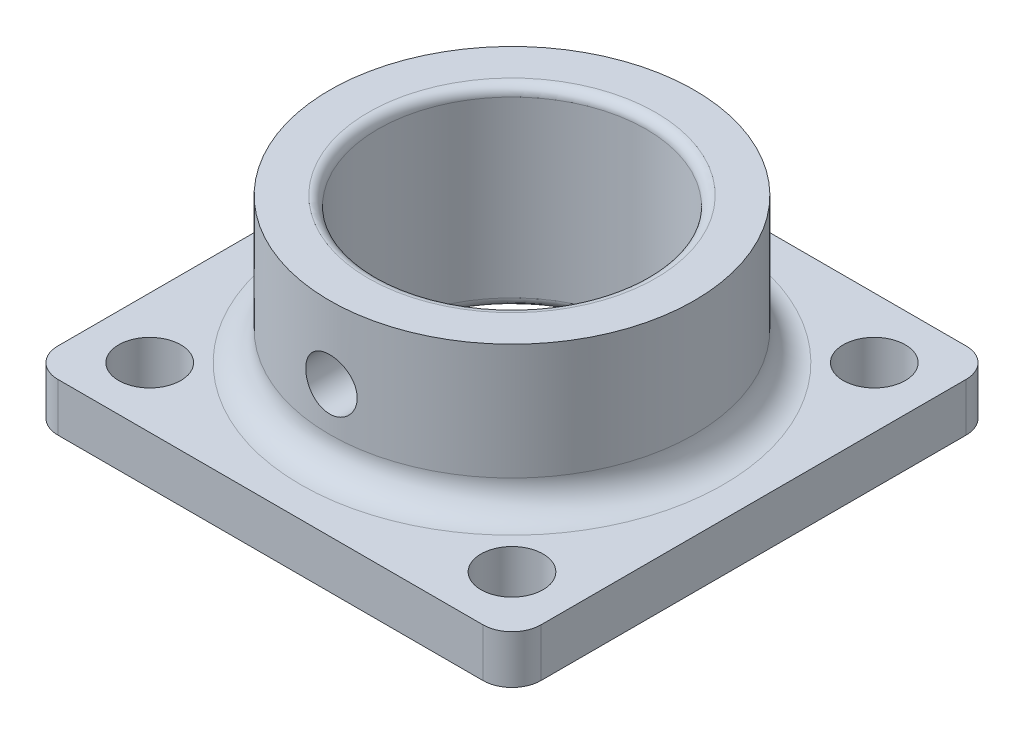
ISO-10303-21;
HEADER;
FILE_DESCRIPTION(('STEP AP214'),'2;1');
FILE_NAME('part.step','',(''),(''),'','','');
FILE_SCHEMA(('AUTOMOTIVE_DESIGN { 1 0 10303 214 1 1 1 1 }'));
ENDSEC;
DATA;
#1=APPLICATION_CONTEXT('core data for automotive mechanical design processes');
#2=APPLICATION_PROTOCOL_DEFINITION('international standard','automotive_design',2000,#1);
#3=PRODUCT_CONTEXT('',#1,'mechanical');
#4=PRODUCT('Part','Part','',(#3));
#5=PRODUCT_RELATED_PRODUCT_CATEGORY('part','',(#4));
#6=PRODUCT_DEFINITION_FORMATION('','',#4);
#7=PRODUCT_DEFINITION_CONTEXT('part definition',#1,'design');
#8=PRODUCT_DEFINITION('design','',#6,#7);
#9=PRODUCT_DEFINITION_SHAPE('','',#8);
#10=(LENGTH_UNIT() NAMED_UNIT(*) SI_UNIT(.MILLI.,.METRE.));
#11=(NAMED_UNIT(*) PLANE_ANGLE_UNIT() SI_UNIT($,.RADIAN.));
#12=(NAMED_UNIT(*) SI_UNIT($,.STERADIAN.) SOLID_ANGLE_UNIT());
#13=UNCERTAINTY_MEASURE_WITH_UNIT(LENGTH_MEASURE(1.E-05),#10,'distance_accuracy_value','');
#14=(GEOMETRIC_REPRESENTATION_CONTEXT(3) GLOBAL_UNCERTAINTY_ASSIGNED_CONTEXT((#13)) GLOBAL_UNIT_ASSIGNED_CONTEXT((#10,
#11,#12)) REPRESENTATION_CONTEXT('',''));
#15=CARTESIAN_POINT('',(0.,0.,0.));
#16=DIRECTION('',(0.,0.,1.));
#17=DIRECTION('',(1.,0.,0.));
#18=AXIS2_PLACEMENT_3D('',#15,#16,#17);
#19=CARTESIAN_POINT('',(0.,2.54,0.));
#20=DIRECTION('',(0.,1.,0.));
#21=DIRECTION('',(0.,0.,1.));
#22=AXIS2_PLACEMENT_3D('',#19,#20,#21);
#23=PLANE('',#22);
#24=CARTESIAN_POINT('',(9.525,2.54,-9.525));
#25=DIRECTION('',(0.,1.,0.));
#26=DIRECTION('',(0.,0.,1.));
#27=AXIS2_PLACEMENT_3D('',#24,#25,#26);
#28=CIRCLE('',#27,1.63194999999999);
#29=CARTESIAN_POINT('',(9.525,2.54,-7.89305000000001));
#30=VERTEX_POINT('',#29);
#31=EDGE_CURVE('E362',#30,#30,#28,.T.);
#32=ORIENTED_EDGE('',*,*,#31,.F.);
#33=EDGE_LOOP('',(#32));
#34=FACE_BOUND('',#33,.T.);
#35=CARTESIAN_POINT('',(9.525,2.54,9.525));
#36=DIRECTION('',(0.,1.,0.));
#37=DIRECTION('',(0.,0.,1.));
#38=AXIS2_PLACEMENT_3D('',#35,#36,#37);
#39=CIRCLE('',#38,1.63194999999999);
#40=CARTESIAN_POINT('',(9.525,2.54,11.15695));
#41=VERTEX_POINT('',#40);
#42=EDGE_CURVE('E364',#41,#41,#39,.T.);
#43=ORIENTED_EDGE('',*,*,#42,.F.);
#44=EDGE_LOOP('',(#43));
#45=FACE_BOUND('',#44,.T.);
#46=CARTESIAN_POINT('',(-9.525,2.54,9.525));
#47=DIRECTION('',(0.,1.,0.));
#48=DIRECTION('',(0.,0.,1.));
#49=AXIS2_PLACEMENT_3D('',#46,#47,#48);
#50=CIRCLE('',#49,1.63194999999999);
#51=CARTESIAN_POINT('',(-9.525,2.54,11.15695));
#52=VERTEX_POINT('',#51);
#53=EDGE_CURVE('E372',#52,#52,#50,.T.);
#54=ORIENTED_EDGE('',*,*,#53,.F.);
#55=EDGE_LOOP('',(#54));
#56=FACE_BOUND('',#55,.T.);
#57=CARTESIAN_POINT('',(-9.525,2.54,-9.525));
#58=DIRECTION('',(0.,1.,0.));
#59=DIRECTION('',(0.,0.,1.));
#60=AXIS2_PLACEMENT_3D('',#57,#58,#59);
#61=CIRCLE('',#60,1.63194999999999);
#62=CARTESIAN_POINT('',(-9.525,2.54,-7.89305000000001));
#63=VERTEX_POINT('',#62);
#64=EDGE_CURVE('E377',#63,#63,#61,.T.);
#65=ORIENTED_EDGE('',*,*,#64,.F.);
#66=EDGE_LOOP('',(#65));
#67=FACE_BOUND('',#66,.T.);
#68=CARTESIAN_POINT('',(0.,2.54,0.));
#69=DIRECTION('',(0.,1.,0.));
#70=DIRECTION('',(0.,0.,1.));
#71=AXIS2_PLACEMENT_3D('',#68,#69,#70);
#72=CIRCLE('',#71,11.1125);
#73=CARTESIAN_POINT('',(0.,2.54,11.1125));
#74=VERTEX_POINT('',#73);
#75=EDGE_CURVE('E388',#74,#74,#72,.F.);
#76=ORIENTED_EDGE('',*,*,#75,.T.);
#77=EDGE_LOOP('',(#76));
#78=FACE_BOUND('',#77,.T.);
#79=DIRECTION('',(-1.,0.,0.));
#80=VECTOR('',#79,1.);
#81=CARTESIAN_POINT('',(-12.7,2.54,-12.7));
#82=LINE('',#81,#80);
#83=CARTESIAN_POINT('',(11.176,2.54,-12.7));
#84=VERTEX_POINT('',#83);
#85=CARTESIAN_POINT('',(-11.176,2.54,-12.7));
#86=VERTEX_POINT('',#85);
#87=EDGE_CURVE('E143',#84,#86,#82,.T.);
#88=ORIENTED_EDGE('',*,*,#87,.T.);
#89=CARTESIAN_POINT('',(-11.176,2.54,-11.176));
#90=DIRECTION('',(0.,1.,0.));
#91=DIRECTION('',(0.,0.,1.));
#92=AXIS2_PLACEMENT_3D('',#89,#90,#91);
#93=CIRCLE('',#92,1.524);
#94=CARTESIAN_POINT('',(-12.7,2.54,-11.176));
#95=VERTEX_POINT('',#94);
#96=EDGE_CURVE('E391',#86,#95,#93,.T.);
#97=ORIENTED_EDGE('',*,*,#96,.T.);
#98=DIRECTION('',(0.,0.,1.));
#99=VECTOR('',#98,1.);
#100=CARTESIAN_POINT('',(-12.7,2.54,-12.7));
#101=LINE('',#100,#99);
#102=CARTESIAN_POINT('',(-12.7,2.54,11.176));
#103=VERTEX_POINT('',#102);
#104=EDGE_CURVE('E126',#95,#103,#101,.T.);
#105=ORIENTED_EDGE('',*,*,#104,.T.);
#106=CARTESIAN_POINT('',(-11.176,2.54,11.176));
#107=DIRECTION('',(0.,1.,0.));
#108=DIRECTION('',(0.,0.,1.));
#109=AXIS2_PLACEMENT_3D('',#106,#107,#108);
#110=CIRCLE('',#109,1.524);
#111=CARTESIAN_POINT('',(-11.176,2.54,12.7));
#112=VERTEX_POINT('',#111);
#113=EDGE_CURVE('E401',#103,#112,#110,.T.);
#114=ORIENTED_EDGE('',*,*,#113,.T.);
#115=DIRECTION('',(1.,0.,0.));
#116=VECTOR('',#115,1.);
#117=CARTESIAN_POINT('',(-12.7,2.54,12.7));
#118=LINE('',#117,#116);
#119=CARTESIAN_POINT('',(11.176,2.54,12.7));
#120=VERTEX_POINT('',#119);
#121=EDGE_CURVE('E407',#112,#120,#118,.T.);
#122=ORIENTED_EDGE('',*,*,#121,.T.);
#123=CARTESIAN_POINT('',(11.176,2.54,11.176));
#124=DIRECTION('',(0.,1.,0.));
#125=DIRECTION('',(0.,0.,1.));
#126=AXIS2_PLACEMENT_3D('',#123,#124,#125);
#127=CIRCLE('',#126,1.524);
#128=CARTESIAN_POINT('',(12.7,2.54,11.176));
#129=VERTEX_POINT('',#128);
#130=EDGE_CURVE('E61',#120,#129,#127,.T.);
#131=ORIENTED_EDGE('',*,*,#130,.T.);
#132=DIRECTION('',(0.,0.,-1.));
#133=VECTOR('',#132,1.);
#134=CARTESIAN_POINT('',(12.7,2.54,-12.7));
#135=LINE('',#134,#133);
#136=CARTESIAN_POINT('',(12.7,2.54,-11.176));
#137=VERTEX_POINT('',#136);
#138=EDGE_CURVE('E396',#129,#137,#135,.T.);
#139=ORIENTED_EDGE('',*,*,#138,.T.);
#140=CARTESIAN_POINT('',(11.176,2.54,-11.176));
#141=DIRECTION('',(0.,1.,0.));
#142=DIRECTION('',(0.,0.,1.));
#143=AXIS2_PLACEMENT_3D('',#140,#141,#142);
#144=CIRCLE('',#143,1.524);
#145=EDGE_CURVE('E393',#137,#84,#144,.T.);
#146=ORIENTED_EDGE('',*,*,#145,.T.);
#147=EDGE_LOOP('',(#88,#97,#105,#114,#122,#131,#139,#146));
#148=FACE_BOUND('',#147,.T.);
#149=ADVANCED_FACE('F39',(#34,#45,#56,#67,#78,#148),#23,.T.);
#150=CARTESIAN_POINT('',(-12.7,2.54,-12.7));
#151=DIRECTION('',(1.,0.,0.));
#152=DIRECTION('',(0.,0.,-1.));
#153=AXIS2_PLACEMENT_3D('',#150,#151,#152);
#154=PLANE('',#153);
#155=ORIENTED_EDGE('',*,*,#104,.F.);
#156=DIRECTION('',(0.,-1.,0.));
#157=VECTOR('',#156,1.);
#158=CARTESIAN_POINT('',(-12.7,2.54,-11.176));
#159=LINE('',#158,#157);
#160=CARTESIAN_POINT('',(-12.7,0.,-11.176));
#161=VERTEX_POINT('',#160);
#162=EDGE_CURVE('E110',#95,#161,#159,.T.);
#163=ORIENTED_EDGE('',*,*,#162,.T.);
#164=DIRECTION('',(0.,0.,1.));
#165=VECTOR('',#164,1.);
#166=CARTESIAN_POINT('',(-12.7,0.,-12.7));
#167=LINE('',#166,#165);
#168=CARTESIAN_POINT('',(-12.7,0.,11.176));
#169=VERTEX_POINT('',#168);
#170=EDGE_CURVE('E123',#161,#169,#167,.T.);
#171=ORIENTED_EDGE('',*,*,#170,.T.);
#172=DIRECTION('',(0.,-1.,0.));
#173=VECTOR('',#172,1.);
#174=CARTESIAN_POINT('',(-12.7,2.54,11.176));
#175=LINE('',#174,#173);
#176=EDGE_CURVE('E128',#169,#103,#175,.F.);
#177=ORIENTED_EDGE('',*,*,#176,.T.);
#178=EDGE_LOOP('',(#155,#163,#171,#177));
#179=FACE_BOUND('',#178,.T.);
#180=ADVANCED_FACE('F122',(#179),#154,.F.);
#181=CARTESIAN_POINT('',(-12.7,2.54,12.7));
#182=DIRECTION('',(0.,0.,-1.));
#183=DIRECTION('',(-1.,0.,0.));
#184=AXIS2_PLACEMENT_3D('',#181,#182,#183);
#185=PLANE('',#184);
#186=ORIENTED_EDGE('',*,*,#121,.F.);
#187=DIRECTION('',(0.,-1.,0.));
#188=VECTOR('',#187,1.);
#189=CARTESIAN_POINT('',(-11.176,2.54,12.7));
#190=LINE('',#189,#188);
#191=CARTESIAN_POINT('',(-11.176,0.,12.7));
#192=VERTEX_POINT('',#191);
#193=EDGE_CURVE('E235',#112,#192,#190,.T.);
#194=ORIENTED_EDGE('',*,*,#193,.T.);
#195=DIRECTION('',(1.,0.,0.));
#196=VECTOR('',#195,1.);
#197=CARTESIAN_POINT('',(-12.7,0.,12.7));
#198=LINE('',#197,#196);
#199=CARTESIAN_POINT('',(11.176,0.,12.7));
#200=VERTEX_POINT('',#199);
#201=EDGE_CURVE('E133',#192,#200,#198,.T.);
#202=ORIENTED_EDGE('',*,*,#201,.T.);
#203=DIRECTION('',(0.,-1.,0.));
#204=VECTOR('',#203,1.);
#205=CARTESIAN_POINT('',(11.176,2.54,12.7));
#206=LINE('',#205,#204);
#207=EDGE_CURVE('E240',#200,#120,#206,.F.);
#208=ORIENTED_EDGE('',*,*,#207,.T.);
#209=EDGE_LOOP('',(#186,#194,#202,#208));
#210=FACE_BOUND('',#209,.T.);
#211=ADVANCED_FACE('F198',(#210),#185,.F.);
#212=CARTESIAN_POINT('',(12.7,2.54,-12.7));
#213=DIRECTION('',(-1.,0.,0.));
#214=DIRECTION('',(0.,0.,1.));
#215=AXIS2_PLACEMENT_3D('',#212,#213,#214);
#216=PLANE('',#215);
#217=DIRECTION('',(0.,0.,-1.));
#218=VECTOR('',#217,1.);
#219=CARTESIAN_POINT('',(12.7,0.,-12.7));
#220=LINE('',#219,#218);
#221=CARTESIAN_POINT('',(12.7,0.,11.176));
#222=VERTEX_POINT('',#221);
#223=CARTESIAN_POINT('',(12.7,0.,-11.176));
#224=VERTEX_POINT('',#223);
#225=EDGE_CURVE('E137',#222,#224,#220,.T.);
#226=ORIENTED_EDGE('',*,*,#225,.T.);
#227=DIRECTION('',(0.,-1.,0.));
#228=VECTOR('',#227,1.);
#229=CARTESIAN_POINT('',(12.7,2.54,-11.176));
#230=LINE('',#229,#228);
#231=EDGE_CURVE('E54',#224,#137,#230,.F.);
#232=ORIENTED_EDGE('',*,*,#231,.T.);
#233=ORIENTED_EDGE('',*,*,#138,.F.);
#234=DIRECTION('',(0.,-1.,0.));
#235=VECTOR('',#234,1.);
#236=CARTESIAN_POINT('',(12.7,2.54,11.176));
#237=LINE('',#236,#235);
#238=EDGE_CURVE('E397',#129,#222,#237,.T.);
#239=ORIENTED_EDGE('',*,*,#238,.T.);
#240=EDGE_LOOP('',(#226,#232,#233,#239));
#241=FACE_BOUND('',#240,.T.);
#242=ADVANCED_FACE('F194',(#241),#216,.F.);
#243=CARTESIAN_POINT('',(-12.7,2.54,-12.7));
#244=DIRECTION('',(0.,0.,1.));
#245=DIRECTION('',(1.,0.,0.));
#246=AXIS2_PLACEMENT_3D('',#243,#244,#245);
#247=PLANE('',#246);
#248=DIRECTION('',(-1.,0.,0.));
#249=VECTOR('',#248,1.);
#250=CARTESIAN_POINT('',(-12.7,0.,-12.7));
#251=LINE('',#250,#249);
#252=CARTESIAN_POINT('',(11.176,0.,-12.7));
#253=VERTEX_POINT('',#252);
#254=CARTESIAN_POINT('',(-11.176,0.,-12.7));
#255=VERTEX_POINT('',#254);
#256=EDGE_CURVE('E147',#253,#255,#251,.T.);
#257=ORIENTED_EDGE('',*,*,#256,.T.);
#258=DIRECTION('',(0.,-1.,0.));
#259=VECTOR('',#258,1.);
#260=CARTESIAN_POINT('',(-11.176,2.54,-12.7));
#261=LINE('',#260,#259);
#262=EDGE_CURVE('E111',#255,#86,#261,.F.);
#263=ORIENTED_EDGE('',*,*,#262,.T.);
#264=ORIENTED_EDGE('',*,*,#87,.F.);
#265=DIRECTION('',(0.,-1.,0.));
#266=VECTOR('',#265,1.);
#267=CARTESIAN_POINT('',(11.176,2.54,-12.7));
#268=LINE('',#267,#266);
#269=EDGE_CURVE('E116',#84,#253,#268,.T.);
#270=ORIENTED_EDGE('',*,*,#269,.T.);
#271=EDGE_LOOP('',(#257,#263,#264,#270));
#272=FACE_BOUND('',#271,.T.);
#273=ADVANCED_FACE('F190',(#272),#247,.F.);
#274=CARTESIAN_POINT('',(0.,0.,0.));
#275=DIRECTION('',(0.,1.,0.));
#276=DIRECTION('',(0.,0.,1.));
#277=AXIS2_PLACEMENT_3D('',#274,#275,#276);
#278=PLANE('',#277);
#279=CARTESIAN_POINT('',(9.525,0.,-9.525));
#280=DIRECTION('',(0.,1.,0.));
#281=DIRECTION('',(0.,0.,1.));
#282=AXIS2_PLACEMENT_3D('',#279,#280,#281);
#283=CIRCLE('',#282,1.63195);
#284=CARTESIAN_POINT('',(9.525,0.,-7.89305));
#285=VERTEX_POINT('',#284);
#286=EDGE_CURVE('E359',#285,#285,#283,.T.);
#287=ORIENTED_EDGE('',*,*,#286,.T.);
#288=EDGE_LOOP('',(#287));
#289=FACE_BOUND('',#288,.T.);
#290=CARTESIAN_POINT('',(9.525,0.,9.525));
#291=DIRECTION('',(0.,1.,0.));
#292=DIRECTION('',(0.,0.,1.));
#293=AXIS2_PLACEMENT_3D('',#290,#291,#292);
#294=CIRCLE('',#293,1.63195);
#295=CARTESIAN_POINT('',(9.525,0.,11.15695));
#296=VERTEX_POINT('',#295);
#297=EDGE_CURVE('E369',#296,#296,#294,.T.);
#298=ORIENTED_EDGE('',*,*,#297,.T.);
#299=EDGE_LOOP('',(#298));
#300=FACE_BOUND('',#299,.T.);
#301=CARTESIAN_POINT('',(-9.525,0.,9.525));
#302=DIRECTION('',(0.,1.,0.));
#303=DIRECTION('',(0.,0.,1.));
#304=AXIS2_PLACEMENT_3D('',#301,#302,#303);
#305=CIRCLE('',#304,1.63195);
#306=CARTESIAN_POINT('',(-9.525,0.,11.15695));
#307=VERTEX_POINT('',#306);
#308=EDGE_CURVE('E375',#307,#307,#305,.T.);
#309=ORIENTED_EDGE('',*,*,#308,.T.);
#310=EDGE_LOOP('',(#309));
#311=FACE_BOUND('',#310,.T.);
#312=CARTESIAN_POINT('',(-9.525,0.,-9.525));
#313=DIRECTION('',(0.,1.,0.));
#314=DIRECTION('',(0.,0.,1.));
#315=AXIS2_PLACEMENT_3D('',#312,#313,#314);
#316=CIRCLE('',#315,1.63195);
#317=CARTESIAN_POINT('',(-9.525,0.,-7.89305));
#318=VERTEX_POINT('',#317);
#319=EDGE_CURVE('E156',#318,#318,#316,.T.);
#320=ORIENTED_EDGE('',*,*,#319,.T.);
#321=EDGE_LOOP('',(#320));
#322=FACE_BOUND('',#321,.T.);
#323=CARTESIAN_POINT('',(0.,0.,0.));
#324=DIRECTION('',(0.,1.,0.));
#325=DIRECTION('',(0.,0.,1.));
#326=AXIS2_PLACEMENT_3D('',#323,#324,#325);
#327=CIRCLE('',#326,7.5565);
#328=CARTESIAN_POINT('',(0.,0.,7.5565));
#329=VERTEX_POINT('',#328);
#330=EDGE_CURVE('E232',#329,#329,#327,.T.);
#331=ORIENTED_EDGE('',*,*,#330,.T.);
#332=EDGE_LOOP('',(#331));
#333=FACE_BOUND('',#332,.T.);
#334=ORIENTED_EDGE('',*,*,#170,.F.);
#335=CARTESIAN_POINT('',(-11.176,0.,-11.176));
#336=DIRECTION('',(0.,1.,0.));
#337=DIRECTION('',(0.,0.,1.));
#338=AXIS2_PLACEMENT_3D('',#335,#336,#337);
#339=CIRCLE('',#338,1.524);
#340=EDGE_CURVE('E106',#161,#255,#339,.F.);
#341=ORIENTED_EDGE('',*,*,#340,.T.);
#342=ORIENTED_EDGE('',*,*,#256,.F.);
#343=CARTESIAN_POINT('',(11.176,0.,-11.176));
#344=DIRECTION('',(0.,1.,0.));
#345=DIRECTION('',(0.,0.,1.));
#346=AXIS2_PLACEMENT_3D('',#343,#344,#345);
#347=CIRCLE('',#346,1.524);
#348=EDGE_CURVE('E117',#253,#224,#347,.F.);
#349=ORIENTED_EDGE('',*,*,#348,.T.);
#350=ORIENTED_EDGE('',*,*,#225,.F.);
#351=CARTESIAN_POINT('',(11.176,0.,11.176));
#352=DIRECTION('',(0.,1.,0.));
#353=DIRECTION('',(0.,0.,1.));
#354=AXIS2_PLACEMENT_3D('',#351,#352,#353);
#355=CIRCLE('',#354,1.524);
#356=EDGE_CURVE('E127',#222,#200,#355,.F.);
#357=ORIENTED_EDGE('',*,*,#356,.T.);
#358=ORIENTED_EDGE('',*,*,#201,.F.);
#359=CARTESIAN_POINT('',(-11.176,0.,11.176));
#360=DIRECTION('',(0.,1.,0.));
#361=DIRECTION('',(0.,0.,1.));
#362=AXIS2_PLACEMENT_3D('',#359,#360,#361);
#363=CIRCLE('',#362,1.524);
#364=EDGE_CURVE('E132',#192,#169,#363,.F.);
#365=ORIENTED_EDGE('',*,*,#364,.T.);
#366=EDGE_LOOP('',(#334,#341,#342,#349,#350,#357,#358,#365));
#367=FACE_BOUND('',#366,.T.);
#368=ADVANCED_FACE('F130',(#289,#300,#311,#322,#333,#367),#278,.F.);
#369=CARTESIAN_POINT('',(0.,10.16,0.));
#370=DIRECTION('',(0.,1.,0.));
#371=DIRECTION('',(0.,0.,1.));
#372=AXIS2_PLACEMENT_3D('',#369,#370,#371);
#373=PLANE('',#372);
#374=CARTESIAN_POINT('',(0.,10.16,0.));
#375=DIRECTION('',(0.,1.,0.));
#376=DIRECTION('',(0.,0.,1.));
#377=AXIS2_PLACEMENT_3D('',#374,#375,#376);
#378=CIRCLE('',#377,7.5565);
#379=CARTESIAN_POINT('',(0.,10.16,7.5565));
#380=VERTEX_POINT('',#379);
#381=EDGE_CURVE('E12',#380,#380,#378,.F.);
#382=ORIENTED_EDGE('',*,*,#381,.T.);
#383=EDGE_LOOP('',(#382));
#384=FACE_BOUND('',#383,.T.);
#385=CARTESIAN_POINT('',(0.,10.16,0.));
#386=DIRECTION('',(0.,1.,0.));
#387=DIRECTION('',(1.,0.,0.));
#388=AXIS2_PLACEMENT_3D('',#385,#386,#387);
#389=CIRCLE('',#388,9.5885);
#390=CARTESIAN_POINT('',(9.5885,10.16,0.));
#391=VERTEX_POINT('',#390);
#392=EDGE_CURVE('E134',#391,#391,#389,.T.);
#393=ORIENTED_EDGE('',*,*,#392,.T.);
#394=EDGE_LOOP('',(#393));
#395=FACE_BOUND('',#394,.T.);
#396=ADVANCED_FACE('F183',(#384,#395),#373,.T.);
#397=CARTESIAN_POINT('',(0.,10.16,0.));
#398=DIRECTION('',(0.,-1.,0.));
#399=DIRECTION('',(0.,0.,-1.));
#400=AXIS2_PLACEMENT_3D('',#397,#398,#399);
#401=CYLINDRICAL_SURFACE('',#400,9.5885);
#402=CARTESIAN_POINT('',(0.,4.064,0.));
#403=DIRECTION('',(0.,1.,0.));
#404=DIRECTION('',(0.,0.,1.));
#405=AXIS2_PLACEMENT_3D('',#402,#403,#404);
#406=CIRCLE('',#405,9.5885);
#407=CARTESIAN_POINT('',(0.,4.064,9.5885));
#408=VERTEX_POINT('',#407);
#409=EDGE_CURVE('E157',#408,#408,#406,.T.);
#410=ORIENTED_EDGE('',*,*,#409,.T.);
#411=EDGE_LOOP('',(#410));
#412=FACE_BOUND('',#411,.T.);
#413=CARTESIAN_POINT('',(1.35255,6.35,9.49262559819463));
#414=CARTESIAN_POINT('',(1.35254684187586,6.27443327742515,9.49262680104449));
#415=CARTESIAN_POINT('',(1.34619575345846,6.19882141404505,9.49353768607996));
#416=CARTESIAN_POINT('',(1.32096385175707,6.04970802500024,9.4970807526332));
#417=CARTESIAN_POINT('',(1.30207048756592,5.97620869026017,9.49971465831887));
#418=CARTESIAN_POINT('',(1.25232735393775,5.83350052407404,9.50639963874441));
#419=CARTESIAN_POINT('',(1.22148635853927,5.7642885872345,9.5104496733029));
#420=CARTESIAN_POINT('',(1.14874341792524,5.63203322529307,9.5195093337313));
#421=CARTESIAN_POINT('',(1.10684313404972,5.56898887563667,9.52451881544088));
#422=CARTESIAN_POINT('',(1.01285329353057,5.45040013760466,9.53497267995307));
#423=CARTESIAN_POINT('',(0.960700811742266,5.39490584113446,9.54041961902949));
#424=CARTESIAN_POINT('',(0.847822753104998,5.29342606361995,9.55111178939157));
#425=CARTESIAN_POINT('',(0.787096722528142,5.24744108614385,9.55635700998321));
#426=CARTESIAN_POINT('',(0.658476534865843,5.1661022520814,9.56608130152127));
#427=CARTESIAN_POINT('',(0.590553106864935,5.13079424806935,9.57055703338003));
#428=CARTESIAN_POINT('',(0.449666643474347,5.07210565760717,9.57820981654434));
#429=CARTESIAN_POINT('',(0.376703844457111,5.04872451215676,9.58138692871355));
#430=CARTESIAN_POINT('',(0.228324543687416,5.01470443482001,9.5860664735923));
#431=CARTESIAN_POINT('',(0.152927583087751,5.00398181050865,9.58757990119622));
#432=CARTESIAN_POINT('',(0.00139036469206027,4.99532346756387,9.58879918796414));
#433=CARTESIAN_POINT('',(-0.074749856156842,4.99738711652992,9.58850513652485));
#434=CARTESIAN_POINT('',(-0.225041854160408,5.01417630752425,9.58615142312569));
#435=CARTESIAN_POINT('',(-0.299203912756296,5.02881182202561,9.58410431517848));
#436=CARTESIAN_POINT('',(-0.444008797147107,5.07018820145419,9.57848851222035));
#437=CARTESIAN_POINT('',(-0.514651541003677,5.09692934808439,9.57491978180076));
#438=CARTESIAN_POINT('',(-0.650687348391013,5.16185141777269,9.56664009090469));
#439=CARTESIAN_POINT('',(-0.716061892257911,5.20007064022377,9.5619253165736));
#440=CARTESIAN_POINT('',(-0.839503584928075,5.28683603678478,9.55187977422239));
#441=CARTESIAN_POINT('',(-0.897570307364665,5.33538281300014,9.54654897029547));
#442=CARTESIAN_POINT('',(-1.00527808640436,5.44192781423349,9.53581192451163));
#443=CARTESIAN_POINT('',(-1.05484144633709,5.50000459080675,9.53040542983015));
#444=CARTESIAN_POINT('',(-1.14352994438801,5.62369301484065,9.52017178539042));
#445=CARTESIAN_POINT('',(-1.1826550315013,5.68930469911715,9.51534463846311));
#446=CARTESIAN_POINT('',(-1.24936455711685,5.82627699120805,9.50681637779108));
#447=CARTESIAN_POINT('',(-1.27694167792624,5.89764121022966,9.50311597844552));
#448=CARTESIAN_POINT('',(-1.31969781357488,6.044051885358,9.49727329023929));
#449=CARTESIAN_POINT('',(-1.3348775966219,6.11909811300153,9.49513090483633));
#450=CARTESIAN_POINT('',(-1.35230298947865,6.27005315822406,9.49266489883587));
#451=CARTESIAN_POINT('',(-1.35465843730401,6.34594905349233,9.49232583372236));
#452=CARTESIAN_POINT('',(-1.34665912866306,6.49705240738136,9.49346391600298));
#453=CARTESIAN_POINT('',(-1.33630471954847,6.57225988475952,9.49494101376262));
#454=CARTESIAN_POINT('',(-1.3032725264402,6.71951547544142,9.49953083990228));
#455=CARTESIAN_POINT('',(-1.28064888232502,6.79157597686934,9.50263638055036));
#456=CARTESIAN_POINT('',(-1.2237765153747,6.93088157110673,9.51012729110326));
#457=CARTESIAN_POINT('',(-1.18952728010596,6.99812645149467,9.51451271742178));
#458=CARTESIAN_POINT('',(-1.11010972012926,7.1263860721883,9.52410589470451));
#459=CARTESIAN_POINT('',(-1.06486994268048,7.18735616624617,9.52931894613921));
#460=CARTESIAN_POINT('',(-0.964855449789803,7.30087783444126,9.53996378378738));
#461=CARTESIAN_POINT('',(-0.910080259307042,7.35342898890818,9.54539558088808));
#462=CARTESIAN_POINT('',(-0.792067547742633,7.44901224745774,9.55591384884784));
#463=CARTESIAN_POINT('',(-0.728770968824252,7.49197179104665,9.56099749817646));
#464=CARTESIAN_POINT('',(-0.595796134048274,7.56664814442643,9.57020348326081));
#465=CARTESIAN_POINT('',(-0.526118036019265,7.59836523217279,9.57432584278237));
#466=CARTESIAN_POINT('',(-0.382590092931747,7.64953892870122,9.58113235124548));
#467=CARTESIAN_POINT('',(-0.308754930966843,7.66903606131047,9.58382124935216));
#468=CARTESIAN_POINT('',(-0.15881810815844,7.69534781928359,9.58747772734268));
#469=CARTESIAN_POINT('',(-0.0827165792368741,7.70216318137464,9.58844540721779));
#470=CARTESIAN_POINT('',(0.0688872190360368,7.70290154749736,9.58854961723151));
#471=CARTESIAN_POINT('',(0.144388959078461,7.69693589432214,9.58770196182756));
#472=CARTESIAN_POINT('',(0.293304694543438,7.67251915785242,9.58430245257344));
#473=CARTESIAN_POINT('',(0.366718694488284,7.65406810160496,9.58175060241506));
#474=CARTESIAN_POINT('',(0.509350403433906,7.60524214667921,9.57522807200373));
#475=CARTESIAN_POINT('',(0.578570487666582,7.57487407149365,9.57125820380157));
#476=CARTESIAN_POINT('',(0.7109500773097,7.50308781266943,9.5623370076334));
#477=CARTESIAN_POINT('',(0.774109432222425,7.46166935472838,9.5573856553049));
#478=CARTESIAN_POINT('',(0.893141126377295,7.36855175504593,9.5470014041403));
#479=CARTESIAN_POINT('',(0.948948621121971,7.31677012403451,9.54156484902935));
#480=CARTESIAN_POINT('',(1.05112357344137,7.2045692805138,9.53085084013466));
#481=CARTESIAN_POINT('',(1.09748880649302,7.1441480382734,9.52557342409177));
#482=CARTESIAN_POINT('',(1.17966546720338,7.01603502599782,9.51574736805364));
#483=CARTESIAN_POINT('',(1.21542367751431,6.94830884431188,9.51120245345929));
#484=CARTESIAN_POINT('',(1.2750055333328,6.80778223850646,9.50339960325673));
#485=CARTESIAN_POINT('',(1.29884179020629,6.73498726957938,9.50014030845997));
#486=CARTESIAN_POINT('',(1.32838038169776,6.60987145007681,9.49604536920493));
#487=CARTESIAN_POINT('',(1.33743044114588,6.55832998137579,9.49476959624194));
#488=CARTESIAN_POINT('',(1.34951631035651,6.45453287131264,9.4930592991931));
#489=CARTESIAN_POINT('',(1.35255218479775,6.40227723763697,9.49262476606025));
#490=CARTESIAN_POINT('',(1.35255,6.35,9.49262559819463));
#491=B_SPLINE_CURVE_WITH_KNOTS('',3,(#413,#414,#415,#416,#417,#418,#419,#420,#421,#422,#423,
#424,#425,#426,#427,#428,#429,#430,#431,#432,#433,#434,#435,#436,#437,#438,#439,#440,#441,#442,
#443,#444,#445,#446,#447,#448,#449,#450,#451,#452,#453,#454,#455,#456,#457,#458,#459,#460,#461,
#462,#463,#464,#465,#466,#467,#468,#469,#470,#471,#472,#473,#474,#475,#476,#477,#478,#479,#480,
#481,#482,#483,#484,#485,#486,#487,#488,#489,#490),.UNSPECIFIED.,.T.,.F.,(4,2,2,2,2,2,2,2,2,2,2,
2,2,2,2,2,2,2,2,2,2,2,2,2,2,2,2,2,2,2,2,2,2,2,2,2,2,2,4),(0.,0.226509128633111,
0.453245264641905,0.679815206046957,0.906351131186805,1.13432351369525,1.36230796544479,
1.59125803532935,1.82019737356037,2.04761443687888,2.27502025239149,2.50081105554009,
2.72660711320257,2.95316512719304,3.17973635333585,3.40827870850493,3.63682218038843,
3.8655102568999,4.09418416155484,4.32089639973435,4.54760244216105,4.77331615397088,
4.99903981609742,5.22627220786499,5.45351592327181,5.68242450334251,5.91132742354355,
6.13946718248451,6.36759368759736,6.59374093666435,6.81988769583207,7.04590515551068,
7.27192822611706,7.49982759243103,7.72778058810004,7.95685863797708,8.18569384763601,
8.34239508448195,8.49909463609699),.UNSPECIFIED.);
#492=CARTESIAN_POINT('',(1.35255,6.35,9.49262559819463));
#493=VERTEX_POINT('',#492);
#494=EDGE_CURVE('E140',#493,#493,#491,.T.);
#495=ORIENTED_EDGE('',*,*,#494,.T.);
#496=EDGE_LOOP('',(#495));
#497=FACE_BOUND('',#496,.T.);
#498=ORIENTED_EDGE('',*,*,#392,.F.);
#499=EDGE_LOOP('',(#498));
#500=FACE_BOUND('',#499,.T.);
#501=ADVANCED_FACE('F179',(#412,#497,#500),#401,.T.);
#502=CARTESIAN_POINT('',(0.,10.16,0.));
#503=DIRECTION('',(0.,-1.,0.));
#504=DIRECTION('',(0.,0.,-1.));
#505=AXIS2_PLACEMENT_3D('',#502,#503,#504);
#506=CYLINDRICAL_SURFACE('',#505,7.0485);
#507=CARTESIAN_POINT('',(0.,0.508,0.));
#508=DIRECTION('',(0.,1.,0.));
#509=DIRECTION('',(0.,0.,1.));
#510=AXIS2_PLACEMENT_3D('',#507,#508,#509);
#511=CIRCLE('',#510,7.0485);
#512=CARTESIAN_POINT('',(0.,0.508,7.0485));
#513=VERTEX_POINT('',#512);
#514=EDGE_CURVE('E47',#513,#513,#511,.F.);
#515=ORIENTED_EDGE('',*,*,#514,.T.);
#516=EDGE_LOOP('',(#515));
#517=FACE_BOUND('',#516,.T.);
#518=CARTESIAN_POINT('',(0.,9.652,0.));
#519=DIRECTION('',(0.,1.,0.));
#520=DIRECTION('',(0.,0.,1.));
#521=AXIS2_PLACEMENT_3D('',#518,#519,#520);
#522=CIRCLE('',#521,7.0485);
#523=CARTESIAN_POINT('',(0.,9.652,7.0485));
#524=VERTEX_POINT('',#523);
#525=EDGE_CURVE('E234',#524,#524,#522,.T.);
#526=ORIENTED_EDGE('',*,*,#525,.T.);
#527=EDGE_LOOP('',(#526));
#528=FACE_BOUND('',#527,.T.);
#529=CARTESIAN_POINT('',(1.35255,6.35,6.91751116713952));
#530=CARTESIAN_POINT('',(1.35254714947919,6.27478093958457,6.9175126386798));
#531=CARTESIAN_POINT('',(1.34625399231427,6.19952527358682,6.91875136178621));
#532=CARTESIAN_POINT('',(1.32126598711347,6.05113834710051,6.92356586291051));
#533=CARTESIAN_POINT('',(1.30256082448947,5.97800890634502,6.92714358463961));
#534=CARTESIAN_POINT('',(1.25334639469152,5.83604284226937,6.93621630014761));
#535=CARTESIAN_POINT('',(1.22284837935032,5.76720219938624,6.94170946586798));
#536=CARTESIAN_POINT('',(1.15094412638809,5.63561811009121,6.95399196087976));
#537=CARTESIAN_POINT('',(1.10953865615789,5.5728742351679,6.96078119897712));
#538=CARTESIAN_POINT('',(1.01641981600512,5.45444308720497,6.97498967065697));
#539=CARTESIAN_POINT('',(0.964591702346762,5.398846791388,6.9824153361858));
#540=CARTESIAN_POINT('',(0.85234674897313,5.29708218337889,6.99700323777766));
#541=CARTESIAN_POINT('',(0.791929332912574,5.25091450435725,7.00416545612267));
#542=CARTESIAN_POINT('',(0.663621541385736,5.16896751319565,7.01748854088841));
#543=CARTESIAN_POINT('',(0.595675277869237,5.13327421328254,7.0236409430701));
#544=CARTESIAN_POINT('',(0.454612574922978,5.07384363216075,7.03417910232362));
#545=CARTESIAN_POINT('',(0.381496581393991,5.05010532123864,7.03856501154145));
#546=CARTESIAN_POINT('',(0.233113167477088,5.01554053866416,7.04503057827118));
#547=CARTESIAN_POINT('',(0.157882707327308,5.00456060821586,7.0471376243079));
#548=CARTESIAN_POINT('',(0.00661993161237425,4.99534589489126,7.04890252469272));
#549=CARTESIAN_POINT('',(-0.0694123119742273,4.99710997750996,7.04856059705481));
#550=CARTESIAN_POINT('',(-0.219067252759358,5.01321596964853,7.04548741719311));
#551=CARTESIAN_POINT('',(-0.292708473263214,5.02739262071621,7.04278755917065));
#552=CARTESIAN_POINT('',(-0.436547027041919,5.06765969740427,7.03533715316918));
#553=CARTESIAN_POINT('',(-0.506744230362617,5.09375057220539,7.03058652787412));
#554=CARTESIAN_POINT('',(-0.642178733621162,5.15726142652491,7.01951614927502));
#555=CARTESIAN_POINT('',(-0.707384497832522,5.19474701329025,7.01318734827553));
#556=CARTESIAN_POINT('',(-0.830641830547363,5.27993480193699,6.99965975771832));
#557=CARTESIAN_POINT('',(-0.888692637385875,5.32763809004361,6.99246087569936));
#558=CARTESIAN_POINT('',(-0.996971905188173,5.43281643024564,6.97785333591899));
#559=CARTESIAN_POINT('',(-1.04705980472884,5.49043608063723,6.97044316583641));
#560=CARTESIAN_POINT('',(-1.13688311996104,5.61333106927574,6.95635841619495));
#561=CARTESIAN_POINT('',(-1.17661836960641,5.67860653028987,6.94968384843539));
#562=CARTESIAN_POINT('',(-1.24465140358745,5.81515190525487,6.93782354891493));
#563=CARTESIAN_POINT('',(-1.27292796059353,5.88643265177857,6.93264058546333));
#564=CARTESIAN_POINT('',(-1.31706331944222,6.0328553784651,6.92439207602589));
#565=CARTESIAN_POINT('',(-1.3329236005499,6.10799689752156,6.92132627780784));
#566=CARTESIAN_POINT('',(-1.3515692981413,6.25873844504804,6.91770934122117));
#567=CARTESIAN_POINT('',(-1.35455701599706,6.33431254326774,6.91711929851458));
#568=CARTESIAN_POINT('',(-1.34791578659265,6.48487957609256,6.91841646157593));
#569=CARTESIAN_POINT('',(-1.33828749458659,6.55987254067729,6.92030353868649));
#570=CARTESIAN_POINT('',(-1.30686148333403,6.7064783273965,6.92630600933609));
#571=CARTESIAN_POINT('',(-1.28517051898006,6.77811490612842,6.93040184581016));
#572=CARTESIAN_POINT('',(-1.23034846245942,6.91673697439822,6.94034338508362));
#573=CARTESIAN_POINT('',(-1.19721649255258,6.98372210660902,6.94618922213636));
#574=CARTESIAN_POINT('',(-1.11998995452526,7.11202898144424,6.95906026732847));
#575=CARTESIAN_POINT('',(-1.07576800710953,7.1732726887708,6.96609884733951));
#576=CARTESIAN_POINT('',(-0.977787897703328,7.28754364350159,6.98052501462285));
#577=CARTESIAN_POINT('',(-0.924028835733402,7.3405701145925,6.98791263478436));
#578=CARTESIAN_POINT('',(-0.807595380342682,7.43766102639035,7.00232993120974));
#579=CARTESIAN_POINT('',(-0.744806392680217,7.48158915921773,7.0093531241502));
#580=CARTESIAN_POINT('',(-0.612622112554647,7.55827277329907,7.02213991313382));
#581=CARTESIAN_POINT('',(-0.54322708284407,7.59102869868553,7.02790355924489));
#582=CARTESIAN_POINT('',(-0.400170892959702,7.64423587303884,7.03749403418658));
#583=CARTESIAN_POINT('',(-0.326534991573086,7.66475308386576,7.0413312277615));
#584=CARTESIAN_POINT('',(-0.176781568660625,7.69311042852709,7.04668074844152));
#585=CARTESIAN_POINT('',(-0.100664322158705,7.70095196245,7.04819333230986));
#586=CARTESIAN_POINT('',(0.0505857215183433,7.70368472502535,7.04871776809473));
#587=CARTESIAN_POINT('',(0.1257147440624,7.69878149893255,7.047769311664));
#588=CARTESIAN_POINT('',(0.274057226497702,7.67661536537717,7.04356105036189));
#589=CARTESIAN_POINT('',(0.347270706652431,7.65935258871441,7.04030126995101));
#590=CARTESIAN_POINT('',(0.489588492673382,7.6130456518596,7.03183700685181));
#591=CARTESIAN_POINT('',(0.558700473206312,7.58402434566897,7.02663629811034));
#592=CARTESIAN_POINT('',(0.691104274476489,7.51504924695623,7.01485212353477));
#593=CARTESIAN_POINT('',(0.754395680332728,7.47509467593464,7.00826855924265));
#594=CARTESIAN_POINT('',(0.874383272903276,7.38468456575389,6.99432009712359));
#595=CARTESIAN_POINT('',(0.930966763955606,7.33408102041561,6.98694499315404));
#596=CARTESIAN_POINT('',(1.03491004507008,7.22411551976274,6.97230775816437));
#597=CARTESIAN_POINT('',(1.08226765816489,7.16475150309333,6.96504565417915));
#598=CARTESIAN_POINT('',(1.16685121506162,7.03825577227971,6.95137894321056));
#599=CARTESIAN_POINT('',(1.20397368087783,6.97105385143706,6.94498340455464));
#600=CARTESIAN_POINT('',(1.2663419999055,6.83126482451043,6.93388360484381));
#601=CARTESIAN_POINT('',(1.29159891403062,6.7586828070662,6.92917776963778));
#602=CARTESIAN_POINT('',(1.32446687294506,6.62991947119526,6.9229570592623));
#603=CARTESIAN_POINT('',(1.33497972552654,6.57448551801203,6.9209271583487));
#604=CARTESIAN_POINT('',(1.34902225372738,6.46270787660511,6.9182036807218));
#605=CARTESIAN_POINT('',(1.35255213599276,6.40636421535202,6.91751006446405));
#606=CARTESIAN_POINT('',(1.35255,6.35,6.91751116713952));
#607=B_SPLINE_CURVE_WITH_KNOTS('',3,(#529,#530,#531,#532,#533,#534,#535,#536,#537,#538,#539,
#540,#541,#542,#543,#544,#545,#546,#547,#548,#549,#550,#551,#552,#553,#554,#555,#556,#557,#558,
#559,#560,#561,#562,#563,#564,#565,#566,#567,#568,#569,#570,#571,#572,#573,#574,#575,#576,#577,
#578,#579,#580,#581,#582,#583,#584,#585,#586,#587,#588,#589,#590,#591,#592,#593,#594,#595,#596,
#597,#598,#599,#600,#601,#602,#603,#604,#605,#606),.UNSPECIFIED.,.T.,.F.,(4,2,2,2,2,2,2,2,2,2,2,
2,2,2,2,2,2,2,2,2,2,2,2,2,2,2,2,2,2,2,2,2,2,2,2,2,2,2,4),(0.,0.225450878131422,
0.451089344813385,0.676513053746346,0.901920907293204,1.12996143047971,1.35801726249594,
1.58789652785306,1.81775598973999,2.044821089026,2.27186597463877,2.49593322368865,
2.72000892104412,2.94540003245062,3.17081511667823,3.39984947997533,3.62888751652868,
3.85834792947971,4.08778100054072,4.31359490679581,4.53939708512497,4.76323200047249,
4.98708409198195,5.21363560170674,5.44020850157673,5.66996309870269,5.89970856125197,
6.12820432796718,6.35667485451839,6.58148359532131,6.80628995703221,7.03066146285167,
7.25504894912841,7.48278974206712,7.71058420852639,7.94060363266286,8.17040820810829,
8.33935126376417,8.50828931983825),.UNSPECIFIED.);
#608=CARTESIAN_POINT('',(1.35255,6.35,6.91751116713952));
#609=VERTEX_POINT('',#608);
#610=EDGE_CURVE('E149',#609,#609,#607,.T.);
#611=ORIENTED_EDGE('',*,*,#610,.F.);
#612=EDGE_LOOP('',(#611));
#613=FACE_BOUND('',#612,.T.);
#614=ADVANCED_FACE('F159',(#517,#528,#613),#506,.F.);
#615=CARTESIAN_POINT('',(0.,6.35,12.7));
#616=DIRECTION('',(0.,0.,1.));
#617=DIRECTION('',(1.,0.,0.));
#618=AXIS2_PLACEMENT_3D('',#615,#616,#617);
#619=CYLINDRICAL_SURFACE('',#618,1.35255);
#620=ORIENTED_EDGE('',*,*,#610,.T.);
#621=EDGE_LOOP('',(#620));
#622=FACE_BOUND('',#621,.T.);
#623=ORIENTED_EDGE('',*,*,#494,.F.);
#624=EDGE_LOOP('',(#623));
#625=FACE_BOUND('',#624,.T.);
#626=ADVANCED_FACE('F162',(#622,#625),#619,.F.);
#627=CARTESIAN_POINT('',(0.,4.064,0.));
#628=DIRECTION('',(0.,1.,0.));
#629=DIRECTION('',(0.,0.,1.));
#630=AXIS2_PLACEMENT_3D('',#627,#628,#629);
#631=TOROIDAL_SURFACE('',#630,11.1125,1.524);
#632=ORIENTED_EDGE('',*,*,#75,.F.);
#633=EDGE_LOOP('',(#632));
#634=FACE_BOUND('',#633,.T.);
#635=ORIENTED_EDGE('',*,*,#409,.F.);
#636=EDGE_LOOP('',(#635));
#637=FACE_BOUND('',#636,.T.);
#638=ADVANCED_FACE('F166',(#634,#637),#631,.F.);
#639=CARTESIAN_POINT('',(-11.176,2.54,-11.176));
#640=DIRECTION('',(0.,-1.,0.));
#641=DIRECTION('',(0.,0.,-1.));
#642=AXIS2_PLACEMENT_3D('',#639,#640,#641);
#643=CYLINDRICAL_SURFACE('',#642,1.524);
#644=ORIENTED_EDGE('',*,*,#96,.F.);
#645=ORIENTED_EDGE('',*,*,#262,.F.);
#646=ORIENTED_EDGE('',*,*,#340,.F.);
#647=ORIENTED_EDGE('',*,*,#162,.F.);
#648=EDGE_LOOP('',(#644,#645,#646,#647));
#649=FACE_BOUND('',#648,.T.);
#650=ADVANCED_FACE('F109',(#649),#643,.T.);
#651=CARTESIAN_POINT('',(11.176,2.54,-11.176));
#652=DIRECTION('',(0.,-1.,0.));
#653=DIRECTION('',(0.,0.,-1.));
#654=AXIS2_PLACEMENT_3D('',#651,#652,#653);
#655=CYLINDRICAL_SURFACE('',#654,1.524);
#656=ORIENTED_EDGE('',*,*,#145,.F.);
#657=ORIENTED_EDGE('',*,*,#231,.F.);
#658=ORIENTED_EDGE('',*,*,#348,.F.);
#659=ORIENTED_EDGE('',*,*,#269,.F.);
#660=EDGE_LOOP('',(#656,#657,#658,#659));
#661=FACE_BOUND('',#660,.T.);
#662=ADVANCED_FACE('F209',(#661),#655,.T.);
#663=CARTESIAN_POINT('',(-11.176,2.54,11.176));
#664=DIRECTION('',(0.,-1.,0.));
#665=DIRECTION('',(0.,0.,-1.));
#666=AXIS2_PLACEMENT_3D('',#663,#664,#665);
#667=CYLINDRICAL_SURFACE('',#666,1.524);
#668=ORIENTED_EDGE('',*,*,#113,.F.);
#669=ORIENTED_EDGE('',*,*,#176,.F.);
#670=ORIENTED_EDGE('',*,*,#364,.F.);
#671=ORIENTED_EDGE('',*,*,#193,.F.);
#672=EDGE_LOOP('',(#668,#669,#670,#671));
#673=FACE_BOUND('',#672,.T.);
#674=ADVANCED_FACE('F212',(#673),#667,.T.);
#675=CARTESIAN_POINT('',(11.176,2.54,11.176));
#676=DIRECTION('',(0.,-1.,0.));
#677=DIRECTION('',(0.,0.,-1.));
#678=AXIS2_PLACEMENT_3D('',#675,#676,#677);
#679=CYLINDRICAL_SURFACE('',#678,1.524);
#680=ORIENTED_EDGE('',*,*,#130,.F.);
#681=ORIENTED_EDGE('',*,*,#207,.F.);
#682=ORIENTED_EDGE('',*,*,#356,.F.);
#683=ORIENTED_EDGE('',*,*,#238,.F.);
#684=EDGE_LOOP('',(#680,#681,#682,#683));
#685=FACE_BOUND('',#684,.T.);
#686=ADVANCED_FACE('F216',(#685),#679,.T.);
#687=CARTESIAN_POINT('',(0.,0.508,0.));
#688=DIRECTION('',(0.,1.,0.));
#689=DIRECTION('',(0.,0.,1.));
#690=AXIS2_PLACEMENT_3D('',#687,#688,#689);
#691=TOROIDAL_SURFACE('',#690,7.5565,0.508);
#692=ORIENTED_EDGE('',*,*,#514,.F.);
#693=EDGE_LOOP('',(#692));
#694=FACE_BOUND('',#693,.T.);
#695=ORIENTED_EDGE('',*,*,#330,.F.);
#696=EDGE_LOOP('',(#695));
#697=FACE_BOUND('',#696,.T.);
#698=ADVANCED_FACE('F219',(#694,#697),#691,.T.);
#699=CARTESIAN_POINT('',(0.,9.652,0.));
#700=DIRECTION('',(0.,1.,0.));
#701=DIRECTION('',(0.,0.,1.));
#702=AXIS2_PLACEMENT_3D('',#699,#700,#701);
#703=TOROIDAL_SURFACE('',#702,7.5565,0.508);
#704=ORIENTED_EDGE('',*,*,#381,.F.);
#705=EDGE_LOOP('',(#704));
#706=FACE_BOUND('',#705,.T.);
#707=ORIENTED_EDGE('',*,*,#525,.F.);
#708=EDGE_LOOP('',(#707));
#709=FACE_BOUND('',#708,.T.);
#710=ADVANCED_FACE('F41',(#706,#709),#703,.T.);
#711=CARTESIAN_POINT('',(-9.525,2.54,-9.525));
#712=DIRECTION('',(0.,1.,0.));
#713=DIRECTION('',(0.,0.,1.));
#714=AXIS2_PLACEMENT_3D('',#711,#712,#713);
#715=CYLINDRICAL_SURFACE('',#714,1.63194999999999);
#716=ORIENTED_EDGE('',*,*,#319,.F.);
#717=EDGE_LOOP('',(#716));
#718=FACE_BOUND('',#717,.T.);
#719=ORIENTED_EDGE('',*,*,#64,.T.);
#720=EDGE_LOOP('',(#719));
#721=FACE_BOUND('',#720,.T.);
#722=ADVANCED_FACE('F168',(#718,#721),#715,.F.);
#723=CARTESIAN_POINT('',(-9.525,2.54,9.525));
#724=DIRECTION('',(0.,1.,0.));
#725=DIRECTION('',(0.,0.,1.));
#726=AXIS2_PLACEMENT_3D('',#723,#724,#725);
#727=CYLINDRICAL_SURFACE('',#726,1.63194999999999);
#728=ORIENTED_EDGE('',*,*,#308,.F.);
#729=EDGE_LOOP('',(#728));
#730=FACE_BOUND('',#729,.T.);
#731=ORIENTED_EDGE('',*,*,#53,.T.);
#732=EDGE_LOOP('',(#731));
#733=FACE_BOUND('',#732,.T.);
#734=ADVANCED_FACE('F324',(#730,#733),#727,.F.);
#735=CARTESIAN_POINT('',(9.525,2.54,9.525));
#736=DIRECTION('',(0.,1.,0.));
#737=DIRECTION('',(0.,0.,1.));
#738=AXIS2_PLACEMENT_3D('',#735,#736,#737);
#739=CYLINDRICAL_SURFACE('',#738,1.63194999999999);
#740=ORIENTED_EDGE('',*,*,#297,.F.);
#741=EDGE_LOOP('',(#740));
#742=FACE_BOUND('',#741,.T.);
#743=ORIENTED_EDGE('',*,*,#42,.T.);
#744=EDGE_LOOP('',(#743));
#745=FACE_BOUND('',#744,.T.);
#746=ADVANCED_FACE('F332',(#742,#745),#739,.F.);
#747=CARTESIAN_POINT('',(9.525,2.54,-9.525));
#748=DIRECTION('',(0.,1.,0.));
#749=DIRECTION('',(0.,0.,1.));
#750=AXIS2_PLACEMENT_3D('',#747,#748,#749);
#751=CYLINDRICAL_SURFACE('',#750,1.63194999999999);
#752=ORIENTED_EDGE('',*,*,#286,.F.);
#753=EDGE_LOOP('',(#752));
#754=FACE_BOUND('',#753,.T.);
#755=ORIENTED_EDGE('',*,*,#31,.T.);
#756=EDGE_LOOP('',(#755));
#757=FACE_BOUND('',#756,.T.);
#758=ADVANCED_FACE('F340',(#754,#757),#751,.F.);
#759=CLOSED_SHELL('',(#149,#180,#211,#242,#273,#368,#396,#501,#614,#626,#638,#650,#662,#674,
#686,#698,#710,#722,#734,#746,#758));
#760=MANIFOLD_SOLID_BREP('B2',#759);
#761=ADVANCED_BREP_SHAPE_REPRESENTATION('',(#18,#760),#14);
#762=SHAPE_DEFINITION_REPRESENTATION(#9,#761);
ENDSEC;
END-ISO-10303-21;
